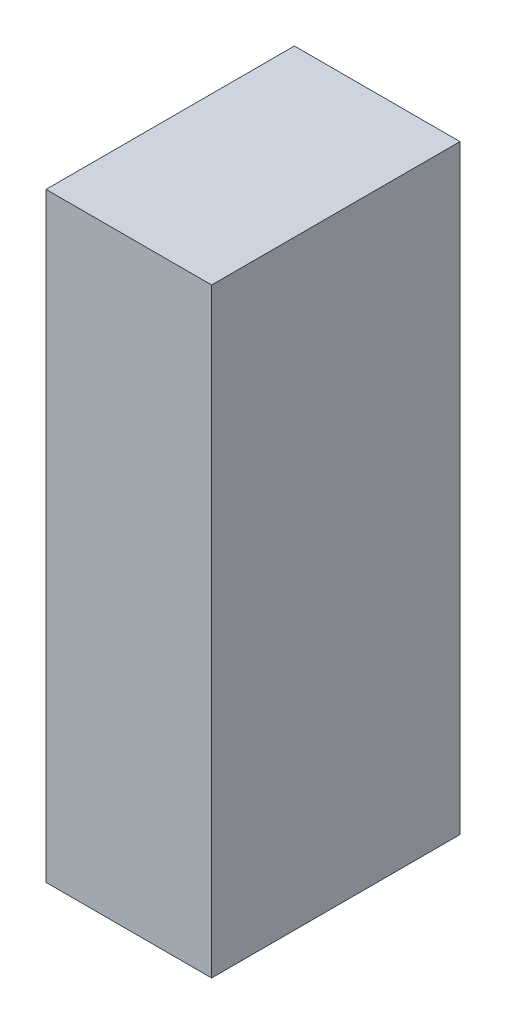
ISO-10303-21;
HEADER;
FILE_DESCRIPTION(('STEP AP214'),'2;1');
FILE_NAME('part.step','',(''),(''),'','','');
FILE_SCHEMA(('AUTOMOTIVE_DESIGN { 1 0 10303 214 1 1 1 1 }'));
ENDSEC;
DATA;
#1=APPLICATION_CONTEXT('core data for automotive mechanical design processes');
#2=APPLICATION_PROTOCOL_DEFINITION('international standard','automotive_design',2000,#1);
#3=PRODUCT_CONTEXT('',#1,'mechanical');
#4=PRODUCT('Part','Part','',(#3));
#5=PRODUCT_RELATED_PRODUCT_CATEGORY('part','',(#4));
#6=PRODUCT_DEFINITION_FORMATION('','',#4);
#7=PRODUCT_DEFINITION_CONTEXT('part definition',#1,'design');
#8=PRODUCT_DEFINITION('design','',#6,#7);
#9=PRODUCT_DEFINITION_SHAPE('','',#8);
#10=(LENGTH_UNIT() NAMED_UNIT(*) SI_UNIT(.MILLI.,.METRE.));
#11=(NAMED_UNIT(*) PLANE_ANGLE_UNIT() SI_UNIT($,.RADIAN.));
#12=(NAMED_UNIT(*) SI_UNIT($,.STERADIAN.) SOLID_ANGLE_UNIT());
#13=UNCERTAINTY_MEASURE_WITH_UNIT(LENGTH_MEASURE(1.E-05),#10,'distance_accuracy_value','');
#14=(GEOMETRIC_REPRESENTATION_CONTEXT(3) GLOBAL_UNCERTAINTY_ASSIGNED_CONTEXT((#13)) GLOBAL_UNIT_ASSIGNED_CONTEXT((#10,
#11,#12)) REPRESENTATION_CONTEXT('',''));
#15=CARTESIAN_POINT('',(0.,0.,0.));
#16=DIRECTION('',(0.,0.,1.));
#17=DIRECTION('',(1.,0.,0.));
#18=AXIS2_PLACEMENT_3D('',#15,#16,#17);
#19=CARTESIAN_POINT('',(-4.,29.,6.));
#20=DIRECTION('',(1.,0.,0.));
#21=DIRECTION('',(0.,0.,-1.));
#22=AXIS2_PLACEMENT_3D('',#19,#20,#21);
#23=PLANE('',#22);
#24=DIRECTION('',(0.,0.,1.));
#25=VECTOR('',#24,1.);
#26=CARTESIAN_POINT('',(-4.,0.,6.));
#27=LINE('',#26,#25);
#28=CARTESIAN_POINT('',(-4.00000000000009,0.,-6.));
#29=VERTEX_POINT('',#28);
#30=CARTESIAN_POINT('',(-4.,0.,6.));
#31=VERTEX_POINT('',#30);
#32=EDGE_CURVE('E91',#29,#31,#27,.T.);
#33=ORIENTED_EDGE('',*,*,#32,.T.);
#34=DIRECTION('',(0.,-1.,0.));
#35=VECTOR('',#34,1.);
#36=CARTESIAN_POINT('',(-4.,29.,6.));
#37=LINE('',#36,#35);
#38=CARTESIAN_POINT('',(-4.,29.,6.));
#39=VERTEX_POINT('',#38);
#40=EDGE_CURVE('E11',#39,#31,#37,.T.);
#41=ORIENTED_EDGE('',*,*,#40,.F.);
#42=DIRECTION('',(0.,0.,1.));
#43=VECTOR('',#42,1.);
#44=CARTESIAN_POINT('',(-4.,29.,6.));
#45=LINE('',#44,#43);
#46=CARTESIAN_POINT('',(-3.99999999999998,29.,-6.));
#47=VERTEX_POINT('',#46);
#48=EDGE_CURVE('E79',#47,#39,#45,.T.);
#49=ORIENTED_EDGE('',*,*,#48,.F.);
#50=DIRECTION('',(0.,-1.,0.));
#51=VECTOR('',#50,1.);
#52=CARTESIAN_POINT('',(-3.99999999999998,29.,-6.));
#53=LINE('',#52,#51);
#54=EDGE_CURVE('E87',#47,#29,#53,.T.);
#55=ORIENTED_EDGE('',*,*,#54,.T.);
#56=EDGE_LOOP('',(#33,#41,#49,#55));
#57=FACE_BOUND('',#56,.T.);
#58=ADVANCED_FACE('F28',(#57),#23,.F.);
#59=CARTESIAN_POINT('',(3.99999999999995,29.0000000000001,6.));
#60=DIRECTION('',(0.,0.,-1.));
#61=DIRECTION('',(-1.,0.,0.));
#62=AXIS2_PLACEMENT_3D('',#59,#60,#61);
#63=PLANE('',#62);
#64=DIRECTION('',(1.,0.,0.));
#65=VECTOR('',#64,1.);
#66=CARTESIAN_POINT('',(3.99999999999998,0.,6.));
#67=LINE('',#66,#65);
#68=CARTESIAN_POINT('',(3.99999999999998,0.,6.));
#69=VERTEX_POINT('',#68);
#70=EDGE_CURVE('E83',#31,#69,#67,.T.);
#71=ORIENTED_EDGE('',*,*,#70,.T.);
#72=DIRECTION('',(0.,-1.,0.));
#73=VECTOR('',#72,1.);
#74=CARTESIAN_POINT('',(3.99999999999995,29.0000000000001,6.));
#75=LINE('',#74,#73);
#76=CARTESIAN_POINT('',(3.99999999999995,29.0000000000001,6.));
#77=VERTEX_POINT('',#76);
#78=EDGE_CURVE('E36',#77,#69,#75,.T.);
#79=ORIENTED_EDGE('',*,*,#78,.F.);
#80=DIRECTION('',(1.,0.,0.));
#81=VECTOR('',#80,1.);
#82=CARTESIAN_POINT('',(3.99999999999995,29.0000000000001,6.));
#83=LINE('',#82,#81);
#84=EDGE_CURVE('E74',#39,#77,#83,.T.);
#85=ORIENTED_EDGE('',*,*,#84,.F.);
#86=ORIENTED_EDGE('',*,*,#40,.T.);
#87=EDGE_LOOP('',(#71,#79,#85,#86));
#88=FACE_BOUND('',#87,.T.);
#89=ADVANCED_FACE('F82',(#88),#63,.F.);
#90=CARTESIAN_POINT('',(3.99999999999995,29.0000000000001,6.));
#91=DIRECTION('',(-1.,0.,0.));
#92=DIRECTION('',(0.,0.,1.));
#93=AXIS2_PLACEMENT_3D('',#90,#91,#92);
#94=PLANE('',#93);
#95=DIRECTION('',(0.,0.,-1.));
#96=VECTOR('',#95,1.);
#97=CARTESIAN_POINT('',(3.99999999999998,0.,6.));
#98=LINE('',#97,#96);
#99=CARTESIAN_POINT('',(3.99999999999989,0.,-6.));
#100=VERTEX_POINT('',#99);
#101=EDGE_CURVE('E61',#69,#100,#98,.T.);
#102=ORIENTED_EDGE('',*,*,#101,.T.);
#103=DIRECTION('',(0.,-1.,0.));
#104=VECTOR('',#103,1.);
#105=CARTESIAN_POINT('',(4.,29.,-6.));
#106=LINE('',#105,#104);
#107=CARTESIAN_POINT('',(4.,29.,-6.));
#108=VERTEX_POINT('',#107);
#109=EDGE_CURVE('E84',#108,#100,#106,.T.);
#110=ORIENTED_EDGE('',*,*,#109,.F.);
#111=DIRECTION('',(0.,0.,-1.));
#112=VECTOR('',#111,1.);
#113=CARTESIAN_POINT('',(3.99999999999995,29.0000000000001,6.));
#114=LINE('',#113,#112);
#115=EDGE_CURVE('E77',#77,#108,#114,.T.);
#116=ORIENTED_EDGE('',*,*,#115,.F.);
#117=ORIENTED_EDGE('',*,*,#78,.T.);
#118=EDGE_LOOP('',(#102,#110,#116,#117));
#119=FACE_BOUND('',#118,.T.);
#120=ADVANCED_FACE('F85',(#119),#94,.F.);
#121=CARTESIAN_POINT('',(4.,29.,-6.));
#122=DIRECTION('',(0.,0.,1.));
#123=DIRECTION('',(1.,0.,0.));
#124=AXIS2_PLACEMENT_3D('',#121,#122,#123);
#125=PLANE('',#124);
#126=DIRECTION('',(-1.,0.,0.));
#127=VECTOR('',#126,1.);
#128=CARTESIAN_POINT('',(3.99999999999989,0.,-6.));
#129=LINE('',#128,#127);
#130=EDGE_CURVE('E67',#100,#29,#129,.T.);
#131=ORIENTED_EDGE('',*,*,#130,.T.);
#132=ORIENTED_EDGE('',*,*,#54,.F.);
#133=DIRECTION('',(-1.,0.,0.));
#134=VECTOR('',#133,1.);
#135=CARTESIAN_POINT('',(4.,29.,-6.));
#136=LINE('',#135,#134);
#137=EDGE_CURVE('E44',#108,#47,#136,.T.);
#138=ORIENTED_EDGE('',*,*,#137,.F.);
#139=ORIENTED_EDGE('',*,*,#109,.T.);
#140=EDGE_LOOP('',(#131,#132,#138,#139));
#141=FACE_BOUND('',#140,.T.);
#142=ADVANCED_FACE('F98',(#141),#125,.F.);
#143=CARTESIAN_POINT('',(0.,29.,0.));
#144=DIRECTION('',(0.,1.,0.));
#145=DIRECTION('',(0.,0.,1.));
#146=AXIS2_PLACEMENT_3D('',#143,#144,#145);
#147=PLANE('',#146);
#148=ORIENTED_EDGE('',*,*,#48,.T.);
#149=ORIENTED_EDGE('',*,*,#84,.T.);
#150=ORIENTED_EDGE('',*,*,#115,.T.);
#151=ORIENTED_EDGE('',*,*,#137,.T.);
#152=EDGE_LOOP('',(#148,#149,#150,#151));
#153=FACE_BOUND('',#152,.T.);
#154=ADVANCED_FACE('F75',(#153),#147,.T.);
#155=CARTESIAN_POINT('',(0.,0.,0.));
#156=DIRECTION('',(0.,1.,0.));
#157=DIRECTION('',(0.,0.,1.));
#158=AXIS2_PLACEMENT_3D('',#155,#156,#157);
#159=PLANE('',#158);
#160=ORIENTED_EDGE('',*,*,#32,.F.);
#161=ORIENTED_EDGE('',*,*,#130,.F.);
#162=ORIENTED_EDGE('',*,*,#101,.F.);
#163=ORIENTED_EDGE('',*,*,#70,.F.);
#164=EDGE_LOOP('',(#160,#161,#162,#163));
#165=FACE_BOUND('',#164,.T.);
#166=ADVANCED_FACE('F101',(#165),#159,.F.);
#167=CLOSED_SHELL('',(#58,#89,#120,#142,#154,#166));
#168=MANIFOLD_SOLID_BREP('B2',#167);
#169=ADVANCED_BREP_SHAPE_REPRESENTATION('',(#18,#168),#14);
#170=SHAPE_DEFINITION_REPRESENTATION(#9,#169);
ENDSEC;
END-ISO-10303-21;
